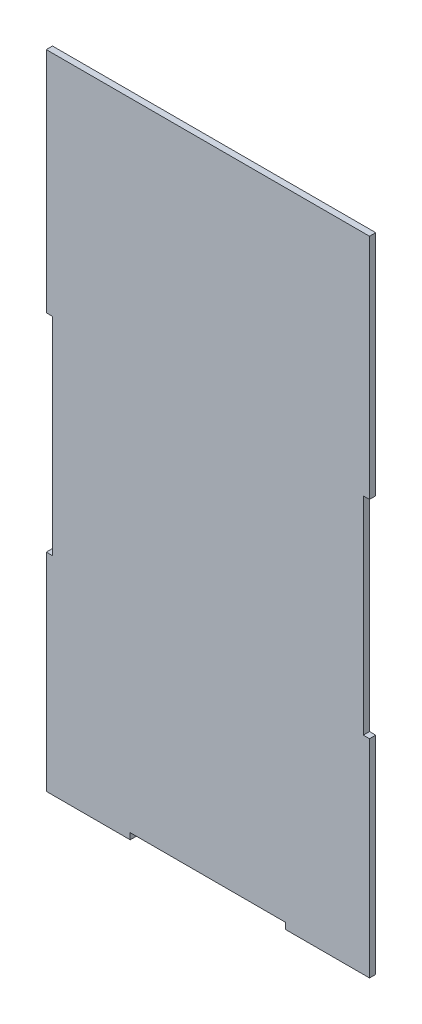
ISO-10303-21;
HEADER;
FILE_DESCRIPTION(('STEP AP214'),'2;1');
FILE_NAME('part.step','',(''),(''),'','','');
FILE_SCHEMA(('AUTOMOTIVE_DESIGN { 1 0 10303 214 1 1 1 1 }'));
ENDSEC;
DATA;
#1=APPLICATION_CONTEXT('core data for automotive mechanical design processes');
#2=APPLICATION_PROTOCOL_DEFINITION('international standard','automotive_design',2000,#1);
#3=PRODUCT_CONTEXT('',#1,'mechanical');
#4=PRODUCT('Part','Part','',(#3));
#5=PRODUCT_RELATED_PRODUCT_CATEGORY('part','',(#4));
#6=PRODUCT_DEFINITION_FORMATION('','',#4);
#7=PRODUCT_DEFINITION_CONTEXT('part definition',#1,'design');
#8=PRODUCT_DEFINITION('design','',#6,#7);
#9=PRODUCT_DEFINITION_SHAPE('','',#8);
#10=(LENGTH_UNIT() NAMED_UNIT(*) SI_UNIT(.MILLI.,.METRE.));
#11=(NAMED_UNIT(*) PLANE_ANGLE_UNIT() SI_UNIT($,.RADIAN.));
#12=(NAMED_UNIT(*) SI_UNIT($,.STERADIAN.) SOLID_ANGLE_UNIT());
#13=UNCERTAINTY_MEASURE_WITH_UNIT(LENGTH_MEASURE(1.E-05),#10,'distance_accuracy_value','');
#14=(GEOMETRIC_REPRESENTATION_CONTEXT(3) GLOBAL_UNCERTAINTY_ASSIGNED_CONTEXT((#13)) GLOBAL_UNIT_ASSIGNED_CONTEXT((#10,
#11,#12)) REPRESENTATION_CONTEXT('',''));
#15=CARTESIAN_POINT('',(0.,0.,0.));
#16=DIRECTION('',(0.,0.,1.));
#17=DIRECTION('',(1.,0.,0.));
#18=AXIS2_PLACEMENT_3D('',#15,#16,#17);
#19=CARTESIAN_POINT('',(0.,0.,3.));
#20=DIRECTION('',(1.,0.,0.));
#21=DIRECTION('',(0.,1.,0.));
#22=AXIS2_PLACEMENT_3D('',#19,#20,#21);
#23=PLANE('',#22);
#24=DIRECTION('',(0.,-1.,0.));
#25=VECTOR('',#24,1.);
#26=CARTESIAN_POINT('',(0.,0.,0.));
#27=LINE('',#26,#25);
#28=CARTESIAN_POINT('',(0.,100.,0.));
#29=VERTEX_POINT('',#28);
#30=CARTESIAN_POINT('',(0.,0.,0.));
#31=VERTEX_POINT('',#30);
#32=EDGE_CURVE('E188',#29,#31,#27,.T.);
#33=ORIENTED_EDGE('',*,*,#32,.T.);
#34=DIRECTION('',(0.,0.,-1.));
#35=VECTOR('',#34,1.);
#36=CARTESIAN_POINT('',(0.,0.,3.));
#37=LINE('',#36,#35);
#38=CARTESIAN_POINT('',(0.,0.,3.));
#39=VERTEX_POINT('',#38);
#40=EDGE_CURVE('E11',#39,#31,#37,.T.);
#41=ORIENTED_EDGE('',*,*,#40,.F.);
#42=DIRECTION('',(0.,-1.,0.));
#43=VECTOR('',#42,1.);
#44=CARTESIAN_POINT('',(0.,0.,3.));
#45=LINE('',#44,#43);
#46=CARTESIAN_POINT('',(0.,100.,3.));
#47=VERTEX_POINT('',#46);
#48=EDGE_CURVE('E234',#47,#39,#45,.T.);
#49=ORIENTED_EDGE('',*,*,#48,.F.);
#50=DIRECTION('',(0.,0.,-1.));
#51=VECTOR('',#50,1.);
#52=CARTESIAN_POINT('',(0.,100.,3.));
#53=LINE('',#52,#51);
#54=EDGE_CURVE('E184',#47,#29,#53,.T.);
#55=ORIENTED_EDGE('',*,*,#54,.T.);
#56=EDGE_LOOP('',(#33,#41,#49,#55));
#57=FACE_BOUND('',#56,.T.);
#58=ADVANCED_FACE('F39',(#57),#23,.F.);
#59=CARTESIAN_POINT('',(0.,0.,3.));
#60=DIRECTION('',(0.,1.,0.));
#61=DIRECTION('',(0.,0.,1.));
#62=AXIS2_PLACEMENT_3D('',#59,#60,#61);
#63=PLANE('',#62);
#64=DIRECTION('',(1.,0.,0.));
#65=VECTOR('',#64,1.);
#66=CARTESIAN_POINT('',(0.,0.,0.));
#67=LINE('',#66,#65);
#68=CARTESIAN_POINT('',(40.5,0.,0.));
#69=VERTEX_POINT('',#68);
#70=EDGE_CURVE('E192',#31,#69,#67,.T.);
#71=ORIENTED_EDGE('',*,*,#70,.T.);
#72=DIRECTION('',(0.,0.,-1.));
#73=VECTOR('',#72,1.);
#74=CARTESIAN_POINT('',(40.5,0.,3.));
#75=LINE('',#74,#73);
#76=CARTESIAN_POINT('',(40.5,0.,3.));
#77=VERTEX_POINT('',#76);
#78=EDGE_CURVE('E48',#77,#69,#75,.T.);
#79=ORIENTED_EDGE('',*,*,#78,.F.);
#80=DIRECTION('',(1.,0.,0.));
#81=VECTOR('',#80,1.);
#82=CARTESIAN_POINT('',(0.,0.,3.));
#83=LINE('',#82,#81);
#84=EDGE_CURVE('E123',#39,#77,#83,.T.);
#85=ORIENTED_EDGE('',*,*,#84,.F.);
#86=ORIENTED_EDGE('',*,*,#40,.T.);
#87=EDGE_LOOP('',(#71,#79,#85,#86));
#88=FACE_BOUND('',#87,.T.);
#89=ADVANCED_FACE('F356',(#88),#63,.F.);
#90=CARTESIAN_POINT('',(40.5,0.,3.));
#91=DIRECTION('',(-1.,0.,0.));
#92=DIRECTION('',(0.,0.,1.));
#93=AXIS2_PLACEMENT_3D('',#90,#91,#92);
#94=PLANE('',#93);
#95=DIRECTION('',(0.,1.,0.));
#96=VECTOR('',#95,1.);
#97=CARTESIAN_POINT('',(40.5,0.,0.));
#98=LINE('',#97,#96);
#99=CARTESIAN_POINT('',(40.5,3.,0.));
#100=VERTEX_POINT('',#99);
#101=EDGE_CURVE('E195',#69,#100,#98,.T.);
#102=ORIENTED_EDGE('',*,*,#101,.T.);
#103=DIRECTION('',(0.,0.,-1.));
#104=VECTOR('',#103,1.);
#105=CARTESIAN_POINT('',(40.5,3.,3.));
#106=LINE('',#105,#104);
#107=CARTESIAN_POINT('',(40.5,3.,3.));
#108=VERTEX_POINT('',#107);
#109=EDGE_CURVE('E277',#108,#100,#106,.T.);
#110=ORIENTED_EDGE('',*,*,#109,.F.);
#111=DIRECTION('',(0.,1.,0.));
#112=VECTOR('',#111,1.);
#113=CARTESIAN_POINT('',(40.5,0.,3.));
#114=LINE('',#113,#112);
#115=EDGE_CURVE('E287',#77,#108,#114,.T.);
#116=ORIENTED_EDGE('',*,*,#115,.F.);
#117=ORIENTED_EDGE('',*,*,#78,.T.);
#118=EDGE_LOOP('',(#102,#110,#116,#117));
#119=FACE_BOUND('',#118,.T.);
#120=ADVANCED_FACE('F285',(#119),#94,.F.);
#121=CARTESIAN_POINT('',(40.5,3.,3.));
#122=DIRECTION('',(0.,1.,0.));
#123=DIRECTION('',(0.,0.,1.));
#124=AXIS2_PLACEMENT_3D('',#121,#122,#123);
#125=PLANE('',#124);
#126=DIRECTION('',(1.,0.,0.));
#127=VECTOR('',#126,1.);
#128=CARTESIAN_POINT('',(40.5,3.,0.));
#129=LINE('',#128,#127);
#130=CARTESIAN_POINT('',(115.5,3.,0.));
#131=VERTEX_POINT('',#130);
#132=EDGE_CURVE('E198',#100,#131,#129,.T.);
#133=ORIENTED_EDGE('',*,*,#132,.T.);
#134=DIRECTION('',(0.,0.,-1.));
#135=VECTOR('',#134,1.);
#136=CARTESIAN_POINT('',(115.5,3.,3.));
#137=LINE('',#136,#135);
#138=CARTESIAN_POINT('',(115.5,3.,3.));
#139=VERTEX_POINT('',#138);
#140=EDGE_CURVE('E273',#139,#131,#137,.T.);
#141=ORIENTED_EDGE('',*,*,#140,.F.);
#142=DIRECTION('',(1.,0.,0.));
#143=VECTOR('',#142,1.);
#144=CARTESIAN_POINT('',(40.5,3.,3.));
#145=LINE('',#144,#143);
#146=EDGE_CURVE('E306',#108,#139,#145,.T.);
#147=ORIENTED_EDGE('',*,*,#146,.F.);
#148=ORIENTED_EDGE('',*,*,#109,.T.);
#149=EDGE_LOOP('',(#133,#141,#147,#148));
#150=FACE_BOUND('',#149,.T.);
#151=ADVANCED_FACE('F296',(#150),#125,.F.);
#152=CARTESIAN_POINT('',(115.5,0.,3.));
#153=DIRECTION('',(1.,0.,0.));
#154=DIRECTION('',(0.,0.,-1.));
#155=AXIS2_PLACEMENT_3D('',#152,#153,#154);
#156=PLANE('',#155);
#157=DIRECTION('',(0.,-1.,0.));
#158=VECTOR('',#157,1.);
#159=CARTESIAN_POINT('',(115.5,0.,0.));
#160=LINE('',#159,#158);
#161=CARTESIAN_POINT('',(115.5,0.,0.));
#162=VERTEX_POINT('',#161);
#163=EDGE_CURVE('E201',#131,#162,#160,.T.);
#164=ORIENTED_EDGE('',*,*,#163,.T.);
#165=DIRECTION('',(0.,0.,-1.));
#166=VECTOR('',#165,1.);
#167=CARTESIAN_POINT('',(115.5,0.,3.));
#168=LINE('',#167,#166);
#169=CARTESIAN_POINT('',(115.5,0.,3.));
#170=VERTEX_POINT('',#169);
#171=EDGE_CURVE('E269',#170,#162,#168,.T.);
#172=ORIENTED_EDGE('',*,*,#171,.F.);
#173=DIRECTION('',(0.,-1.,0.));
#174=VECTOR('',#173,1.);
#175=CARTESIAN_POINT('',(115.5,0.,3.));
#176=LINE('',#175,#174);
#177=EDGE_CURVE('E302',#139,#170,#176,.T.);
#178=ORIENTED_EDGE('',*,*,#177,.F.);
#179=ORIENTED_EDGE('',*,*,#140,.T.);
#180=EDGE_LOOP('',(#164,#172,#178,#179));
#181=FACE_BOUND('',#180,.T.);
#182=ADVANCED_FACE('F300',(#181),#156,.F.);
#183=CARTESIAN_POINT('',(115.5,0.,3.));
#184=DIRECTION('',(0.,1.,0.));
#185=DIRECTION('',(0.,0.,1.));
#186=AXIS2_PLACEMENT_3D('',#183,#184,#185);
#187=PLANE('',#186);
#188=DIRECTION('',(1.,0.,0.));
#189=VECTOR('',#188,1.);
#190=CARTESIAN_POINT('',(115.5,0.,0.));
#191=LINE('',#190,#189);
#192=CARTESIAN_POINT('',(156.,0.,0.));
#193=VERTEX_POINT('',#192);
#194=EDGE_CURVE('E204',#162,#193,#191,.T.);
#195=ORIENTED_EDGE('',*,*,#194,.T.);
#196=DIRECTION('',(0.,0.,-1.));
#197=VECTOR('',#196,1.);
#198=CARTESIAN_POINT('',(156.,0.,3.));
#199=LINE('',#198,#197);
#200=CARTESIAN_POINT('',(156.,0.,3.));
#201=VERTEX_POINT('',#200);
#202=EDGE_CURVE('E265',#201,#193,#199,.T.);
#203=ORIENTED_EDGE('',*,*,#202,.F.);
#204=DIRECTION('',(1.,0.,0.));
#205=VECTOR('',#204,1.);
#206=CARTESIAN_POINT('',(115.5,0.,3.));
#207=LINE('',#206,#205);
#208=EDGE_CURVE('E305',#170,#201,#207,.T.);
#209=ORIENTED_EDGE('',*,*,#208,.F.);
#210=ORIENTED_EDGE('',*,*,#171,.T.);
#211=EDGE_LOOP('',(#195,#203,#209,#210));
#212=FACE_BOUND('',#211,.T.);
#213=ADVANCED_FACE('F369',(#212),#187,.F.);
#214=CARTESIAN_POINT('',(156.,0.,3.));
#215=DIRECTION('',(-1.,0.,0.));
#216=DIRECTION('',(0.,0.,1.));
#217=AXIS2_PLACEMENT_3D('',#214,#215,#216);
#218=PLANE('',#217);
#219=DIRECTION('',(0.,1.,0.));
#220=VECTOR('',#219,1.);
#221=CARTESIAN_POINT('',(156.,0.,0.));
#222=LINE('',#221,#220);
#223=CARTESIAN_POINT('',(156.,100.,0.));
#224=VERTEX_POINT('',#223);
#225=EDGE_CURVE('E207',#193,#224,#222,.T.);
#226=ORIENTED_EDGE('',*,*,#225,.T.);
#227=DIRECTION('',(0.,0.,-1.));
#228=VECTOR('',#227,1.);
#229=CARTESIAN_POINT('',(156.,100.,3.));
#230=LINE('',#229,#228);
#231=CARTESIAN_POINT('',(156.,100.,3.));
#232=VERTEX_POINT('',#231);
#233=EDGE_CURVE('E261',#232,#224,#230,.T.);
#234=ORIENTED_EDGE('',*,*,#233,.F.);
#235=DIRECTION('',(0.,1.,0.));
#236=VECTOR('',#235,1.);
#237=CARTESIAN_POINT('',(156.,0.,3.));
#238=LINE('',#237,#236);
#239=EDGE_CURVE('E310',#201,#232,#238,.T.);
#240=ORIENTED_EDGE('',*,*,#239,.F.);
#241=ORIENTED_EDGE('',*,*,#202,.T.);
#242=EDGE_LOOP('',(#226,#234,#240,#241));
#243=FACE_BOUND('',#242,.T.);
#244=ADVANCED_FACE('F372',(#243),#218,.F.);
#245=CARTESIAN_POINT('',(156.,100.,3.));
#246=DIRECTION('',(0.,-1.,0.));
#247=DIRECTION('',(1.,0.,0.));
#248=AXIS2_PLACEMENT_3D('',#245,#246,#247);
#249=PLANE('',#248);
#250=DIRECTION('',(-1.,0.,0.));
#251=VECTOR('',#250,1.);
#252=CARTESIAN_POINT('',(156.,100.,0.));
#253=LINE('',#252,#251);
#254=CARTESIAN_POINT('',(153.,100.,0.));
#255=VERTEX_POINT('',#254);
#256=EDGE_CURVE('E210',#224,#255,#253,.T.);
#257=ORIENTED_EDGE('',*,*,#256,.T.);
#258=DIRECTION('',(0.,0.,-1.));
#259=VECTOR('',#258,1.);
#260=CARTESIAN_POINT('',(153.,100.,3.));
#261=LINE('',#260,#259);
#262=CARTESIAN_POINT('',(153.,100.,3.));
#263=VERTEX_POINT('',#262);
#264=EDGE_CURVE('E257',#263,#255,#261,.T.);
#265=ORIENTED_EDGE('',*,*,#264,.F.);
#266=DIRECTION('',(-1.,0.,0.));
#267=VECTOR('',#266,1.);
#268=CARTESIAN_POINT('',(156.,100.,3.));
#269=LINE('',#268,#267);
#270=EDGE_CURVE('E317',#232,#263,#269,.T.);
#271=ORIENTED_EDGE('',*,*,#270,.F.);
#272=ORIENTED_EDGE('',*,*,#233,.T.);
#273=EDGE_LOOP('',(#257,#265,#271,#272));
#274=FACE_BOUND('',#273,.T.);
#275=ADVANCED_FACE('F376',(#274),#249,.F.);
#276=CARTESIAN_POINT('',(153.,100.,3.));
#277=DIRECTION('',(-1.,0.,0.));
#278=DIRECTION('',(0.,0.,1.));
#279=AXIS2_PLACEMENT_3D('',#276,#277,#278);
#280=PLANE('',#279);
#281=DIRECTION('',(0.,1.,0.));
#282=VECTOR('',#281,1.);
#283=CARTESIAN_POINT('',(153.,100.,0.));
#284=LINE('',#283,#282);
#285=CARTESIAN_POINT('',(153.,200.,0.));
#286=VERTEX_POINT('',#285);
#287=EDGE_CURVE('E213',#255,#286,#284,.T.);
#288=ORIENTED_EDGE('',*,*,#287,.T.);
#289=DIRECTION('',(0.,0.,-1.));
#290=VECTOR('',#289,1.);
#291=CARTESIAN_POINT('',(153.,200.,3.));
#292=LINE('',#291,#290);
#293=CARTESIAN_POINT('',(153.,200.,3.));
#294=VERTEX_POINT('',#293);
#295=EDGE_CURVE('E253',#294,#286,#292,.T.);
#296=ORIENTED_EDGE('',*,*,#295,.F.);
#297=DIRECTION('',(0.,1.,0.));
#298=VECTOR('',#297,1.);
#299=CARTESIAN_POINT('',(153.,100.,3.));
#300=LINE('',#299,#298);
#301=EDGE_CURVE('E320',#263,#294,#300,.T.);
#302=ORIENTED_EDGE('',*,*,#301,.F.);
#303=ORIENTED_EDGE('',*,*,#264,.T.);
#304=EDGE_LOOP('',(#288,#296,#302,#303));
#305=FACE_BOUND('',#304,.T.);
#306=ADVANCED_FACE('F380',(#305),#280,.F.);
#307=CARTESIAN_POINT('',(156.,200.,3.));
#308=DIRECTION('',(0.,1.,0.));
#309=DIRECTION('',(0.,0.,1.));
#310=AXIS2_PLACEMENT_3D('',#307,#308,#309);
#311=PLANE('',#310);
#312=DIRECTION('',(1.,0.,0.));
#313=VECTOR('',#312,1.);
#314=CARTESIAN_POINT('',(156.,200.,0.));
#315=LINE('',#314,#313);
#316=CARTESIAN_POINT('',(156.,200.,0.));
#317=VERTEX_POINT('',#316);
#318=EDGE_CURVE('E216',#286,#317,#315,.T.);
#319=ORIENTED_EDGE('',*,*,#318,.T.);
#320=DIRECTION('',(0.,0.,-1.));
#321=VECTOR('',#320,1.);
#322=CARTESIAN_POINT('',(156.,200.,3.));
#323=LINE('',#322,#321);
#324=CARTESIAN_POINT('',(156.,200.,3.));
#325=VERTEX_POINT('',#324);
#326=EDGE_CURVE('E249',#325,#317,#323,.T.);
#327=ORIENTED_EDGE('',*,*,#326,.F.);
#328=DIRECTION('',(1.,0.,0.));
#329=VECTOR('',#328,1.);
#330=CARTESIAN_POINT('',(156.,200.,3.));
#331=LINE('',#330,#329);
#332=EDGE_CURVE('E323',#294,#325,#331,.T.);
#333=ORIENTED_EDGE('',*,*,#332,.F.);
#334=ORIENTED_EDGE('',*,*,#295,.T.);
#335=EDGE_LOOP('',(#319,#327,#333,#334));
#336=FACE_BOUND('',#335,.T.);
#337=ADVANCED_FACE('F384',(#336),#311,.F.);
#338=CARTESIAN_POINT('',(156.,200.,3.));
#339=DIRECTION('',(-1.,0.,0.));
#340=DIRECTION('',(0.,0.,1.));
#341=AXIS2_PLACEMENT_3D('',#338,#339,#340);
#342=PLANE('',#341);
#343=DIRECTION('',(0.,1.,0.));
#344=VECTOR('',#343,1.);
#345=CARTESIAN_POINT('',(156.,200.,0.));
#346=LINE('',#345,#344);
#347=CARTESIAN_POINT('',(156.,310.,0.));
#348=VERTEX_POINT('',#347);
#349=EDGE_CURVE('E219',#317,#348,#346,.T.);
#350=ORIENTED_EDGE('',*,*,#349,.T.);
#351=DIRECTION('',(0.,0.,-1.));
#352=VECTOR('',#351,1.);
#353=CARTESIAN_POINT('',(156.,310.,3.));
#354=LINE('',#353,#352);
#355=CARTESIAN_POINT('',(156.,310.,3.));
#356=VERTEX_POINT('',#355);
#357=EDGE_CURVE('E245',#356,#348,#354,.T.);
#358=ORIENTED_EDGE('',*,*,#357,.F.);
#359=DIRECTION('',(0.,1.,0.));
#360=VECTOR('',#359,1.);
#361=CARTESIAN_POINT('',(156.,200.,3.));
#362=LINE('',#361,#360);
#363=EDGE_CURVE('E326',#325,#356,#362,.T.);
#364=ORIENTED_EDGE('',*,*,#363,.F.);
#365=ORIENTED_EDGE('',*,*,#326,.T.);
#366=EDGE_LOOP('',(#350,#358,#364,#365));
#367=FACE_BOUND('',#366,.T.);
#368=ADVANCED_FACE('F388',(#367),#342,.F.);
#369=CARTESIAN_POINT('',(0.,310.,3.));
#370=DIRECTION('',(0.,-1.,0.));
#371=DIRECTION('',(0.,0.,-1.));
#372=AXIS2_PLACEMENT_3D('',#369,#370,#371);
#373=PLANE('',#372);
#374=DIRECTION('',(-1.,0.,0.));
#375=VECTOR('',#374,1.);
#376=CARTESIAN_POINT('',(0.,310.,0.));
#377=LINE('',#376,#375);
#378=CARTESIAN_POINT('',(0.,310.,0.));
#379=VERTEX_POINT('',#378);
#380=EDGE_CURVE('E222',#348,#379,#377,.T.);
#381=ORIENTED_EDGE('',*,*,#380,.T.);
#382=DIRECTION('',(0.,0.,-1.));
#383=VECTOR('',#382,1.);
#384=CARTESIAN_POINT('',(0.,310.,3.));
#385=LINE('',#384,#383);
#386=CARTESIAN_POINT('',(0.,310.,3.));
#387=VERTEX_POINT('',#386);
#388=EDGE_CURVE('E241',#387,#379,#385,.T.);
#389=ORIENTED_EDGE('',*,*,#388,.F.);
#390=DIRECTION('',(-1.,0.,0.));
#391=VECTOR('',#390,1.);
#392=CARTESIAN_POINT('',(0.,310.,3.));
#393=LINE('',#392,#391);
#394=EDGE_CURVE('E329',#356,#387,#393,.T.);
#395=ORIENTED_EDGE('',*,*,#394,.F.);
#396=ORIENTED_EDGE('',*,*,#357,.T.);
#397=EDGE_LOOP('',(#381,#389,#395,#396));
#398=FACE_BOUND('',#397,.T.);
#399=ADVANCED_FACE('F337',(#398),#373,.F.);
#400=CARTESIAN_POINT('',(0.,200.,3.));
#401=DIRECTION('',(1.,0.,0.));
#402=DIRECTION('',(0.,1.,0.));
#403=AXIS2_PLACEMENT_3D('',#400,#401,#402);
#404=PLANE('',#403);
#405=DIRECTION('',(0.,-1.,0.));
#406=VECTOR('',#405,1.);
#407=CARTESIAN_POINT('',(0.,200.,0.));
#408=LINE('',#407,#406);
#409=CARTESIAN_POINT('',(0.,200.,0.));
#410=VERTEX_POINT('',#409);
#411=EDGE_CURVE('E225',#379,#410,#408,.T.);
#412=ORIENTED_EDGE('',*,*,#411,.T.);
#413=DIRECTION('',(0.,0.,-1.));
#414=VECTOR('',#413,1.);
#415=CARTESIAN_POINT('',(0.,200.,3.));
#416=LINE('',#415,#414);
#417=CARTESIAN_POINT('',(0.,200.,3.));
#418=VERTEX_POINT('',#417);
#419=EDGE_CURVE('E177',#418,#410,#416,.T.);
#420=ORIENTED_EDGE('',*,*,#419,.F.);
#421=DIRECTION('',(0.,-1.,0.));
#422=VECTOR('',#421,1.);
#423=CARTESIAN_POINT('',(0.,200.,3.));
#424=LINE('',#423,#422);
#425=EDGE_CURVE('E166',#387,#418,#424,.T.);
#426=ORIENTED_EDGE('',*,*,#425,.F.);
#427=ORIENTED_EDGE('',*,*,#388,.T.);
#428=EDGE_LOOP('',(#412,#420,#426,#427));
#429=FACE_BOUND('',#428,.T.);
#430=ADVANCED_FACE('F341',(#429),#404,.F.);
#431=CARTESIAN_POINT('',(0.,200.,3.));
#432=DIRECTION('',(0.,1.,0.));
#433=DIRECTION('',(0.,0.,1.));
#434=AXIS2_PLACEMENT_3D('',#431,#432,#433);
#435=PLANE('',#434);
#436=DIRECTION('',(1.,0.,0.));
#437=VECTOR('',#436,1.);
#438=CARTESIAN_POINT('',(0.,200.,0.));
#439=LINE('',#438,#437);
#440=CARTESIAN_POINT('',(3.,200.,0.));
#441=VERTEX_POINT('',#440);
#442=EDGE_CURVE('E175',#410,#441,#439,.T.);
#443=ORIENTED_EDGE('',*,*,#442,.T.);
#444=DIRECTION('',(0.,0.,-1.));
#445=VECTOR('',#444,1.);
#446=CARTESIAN_POINT('',(3.,200.,3.));
#447=LINE('',#446,#445);
#448=CARTESIAN_POINT('',(3.,200.,3.));
#449=VERTEX_POINT('',#448);
#450=EDGE_CURVE('E172',#449,#441,#447,.T.);
#451=ORIENTED_EDGE('',*,*,#450,.F.);
#452=DIRECTION('',(1.,0.,0.));
#453=VECTOR('',#452,1.);
#454=CARTESIAN_POINT('',(0.,200.,3.));
#455=LINE('',#454,#453);
#456=EDGE_CURVE('E160',#418,#449,#455,.T.);
#457=ORIENTED_EDGE('',*,*,#456,.F.);
#458=ORIENTED_EDGE('',*,*,#419,.T.);
#459=EDGE_LOOP('',(#443,#451,#457,#458));
#460=FACE_BOUND('',#459,.T.);
#461=ADVANCED_FACE('F173',(#460),#435,.F.);
#462=CARTESIAN_POINT('',(3.,200.,3.));
#463=DIRECTION('',(1.,0.,0.));
#464=DIRECTION('',(0.,1.,0.));
#465=AXIS2_PLACEMENT_3D('',#462,#463,#464);
#466=PLANE('',#465);
#467=DIRECTION('',(0.,-1.,0.));
#468=VECTOR('',#467,1.);
#469=CARTESIAN_POINT('',(3.,200.,0.));
#470=LINE('',#469,#468);
#471=CARTESIAN_POINT('',(3.00000000000001,100.,0.));
#472=VERTEX_POINT('',#471);
#473=EDGE_CURVE('E109',#441,#472,#470,.T.);
#474=ORIENTED_EDGE('',*,*,#473,.T.);
#475=DIRECTION('',(0.,0.,-1.));
#476=VECTOR('',#475,1.);
#477=CARTESIAN_POINT('',(3.00000000000001,100.,3.));
#478=LINE('',#477,#476);
#479=CARTESIAN_POINT('',(3.00000000000001,100.,3.));
#480=VERTEX_POINT('',#479);
#481=EDGE_CURVE('E178',#480,#472,#478,.T.);
#482=ORIENTED_EDGE('',*,*,#481,.F.);
#483=DIRECTION('',(0.,-1.,0.));
#484=VECTOR('',#483,1.);
#485=CARTESIAN_POINT('',(3.,200.,3.));
#486=LINE('',#485,#484);
#487=EDGE_CURVE('E164',#449,#480,#486,.T.);
#488=ORIENTED_EDGE('',*,*,#487,.F.);
#489=ORIENTED_EDGE('',*,*,#450,.T.);
#490=EDGE_LOOP('',(#474,#482,#488,#489));
#491=FACE_BOUND('',#490,.T.);
#492=ADVANCED_FACE('F180',(#491),#466,.F.);
#493=CARTESIAN_POINT('',(0.,100.,3.));
#494=DIRECTION('',(0.,-1.,0.));
#495=DIRECTION('',(0.,0.,-1.));
#496=AXIS2_PLACEMENT_3D('',#493,#494,#495);
#497=PLANE('',#496);
#498=DIRECTION('',(-1.,0.,0.));
#499=VECTOR('',#498,1.);
#500=CARTESIAN_POINT('',(0.,100.,0.));
#501=LINE('',#500,#499);
#502=EDGE_CURVE('E115',#472,#29,#501,.T.);
#503=ORIENTED_EDGE('',*,*,#502,.T.);
#504=ORIENTED_EDGE('',*,*,#54,.F.);
#505=DIRECTION('',(-1.,0.,0.));
#506=VECTOR('',#505,1.);
#507=CARTESIAN_POINT('',(0.,100.,3.));
#508=LINE('',#507,#506);
#509=EDGE_CURVE('E56',#480,#47,#508,.T.);
#510=ORIENTED_EDGE('',*,*,#509,.F.);
#511=ORIENTED_EDGE('',*,*,#481,.T.);
#512=EDGE_LOOP('',(#503,#504,#510,#511));
#513=FACE_BOUND('',#512,.T.);
#514=ADVANCED_FACE('F345',(#513),#497,.F.);
#515=CARTESIAN_POINT('',(0.,0.,3.));
#516=DIRECTION('',(0.,0.,-1.));
#517=DIRECTION('',(-1.,0.,0.));
#518=AXIS2_PLACEMENT_3D('',#515,#516,#517);
#519=PLANE('',#518);
#520=ORIENTED_EDGE('',*,*,#48,.T.);
#521=ORIENTED_EDGE('',*,*,#84,.T.);
#522=ORIENTED_EDGE('',*,*,#115,.T.);
#523=ORIENTED_EDGE('',*,*,#146,.T.);
#524=ORIENTED_EDGE('',*,*,#177,.T.);
#525=ORIENTED_EDGE('',*,*,#208,.T.);
#526=ORIENTED_EDGE('',*,*,#239,.T.);
#527=ORIENTED_EDGE('',*,*,#270,.T.);
#528=ORIENTED_EDGE('',*,*,#301,.T.);
#529=ORIENTED_EDGE('',*,*,#332,.T.);
#530=ORIENTED_EDGE('',*,*,#363,.T.);
#531=ORIENTED_EDGE('',*,*,#394,.T.);
#532=ORIENTED_EDGE('',*,*,#425,.T.);
#533=ORIENTED_EDGE('',*,*,#456,.T.);
#534=ORIENTED_EDGE('',*,*,#487,.T.);
#535=ORIENTED_EDGE('',*,*,#509,.T.);
#536=EDGE_LOOP('',(#520,#521,#522,#523,#524,#525,#526,#527,#528,#529,#530,#531,#532,#533,#534,#535));
#537=FACE_BOUND('',#536,.T.);
#538=ADVANCED_FACE('F162',(#537),#519,.F.);
#539=CARTESIAN_POINT('',(0.,0.,0.));
#540=DIRECTION('',(0.,0.,-1.));
#541=DIRECTION('',(-1.,0.,0.));
#542=AXIS2_PLACEMENT_3D('',#539,#540,#541);
#543=PLANE('',#542);
#544=ORIENTED_EDGE('',*,*,#32,.F.);
#545=ORIENTED_EDGE('',*,*,#502,.F.);
#546=ORIENTED_EDGE('',*,*,#473,.F.);
#547=ORIENTED_EDGE('',*,*,#442,.F.);
#548=ORIENTED_EDGE('',*,*,#411,.F.);
#549=ORIENTED_EDGE('',*,*,#380,.F.);
#550=ORIENTED_EDGE('',*,*,#349,.F.);
#551=ORIENTED_EDGE('',*,*,#318,.F.);
#552=ORIENTED_EDGE('',*,*,#287,.F.);
#553=ORIENTED_EDGE('',*,*,#256,.F.);
#554=ORIENTED_EDGE('',*,*,#225,.F.);
#555=ORIENTED_EDGE('',*,*,#194,.F.);
#556=ORIENTED_EDGE('',*,*,#163,.F.);
#557=ORIENTED_EDGE('',*,*,#132,.F.);
#558=ORIENTED_EDGE('',*,*,#101,.F.);
#559=ORIENTED_EDGE('',*,*,#70,.F.);
#560=EDGE_LOOP('',(#544,#545,#546,#547,#548,#549,#550,#551,#552,#553,#554,#555,#556,#557,#558,#559));
#561=FACE_BOUND('',#560,.T.);
#562=ADVANCED_FACE('F291',(#561),#543,.T.);
#563=CLOSED_SHELL('',(#58,#89,#120,#151,#182,#213,#244,#275,#306,#337,#368,#399,#430,#461,#492,
#514,#538,#562));
#564=MANIFOLD_SOLID_BREP('B2',#563);
#565=ADVANCED_BREP_SHAPE_REPRESENTATION('',(#18,#564),#14);
#566=SHAPE_DEFINITION_REPRESENTATION(#9,#565);
ENDSEC;
END-ISO-10303-21;
